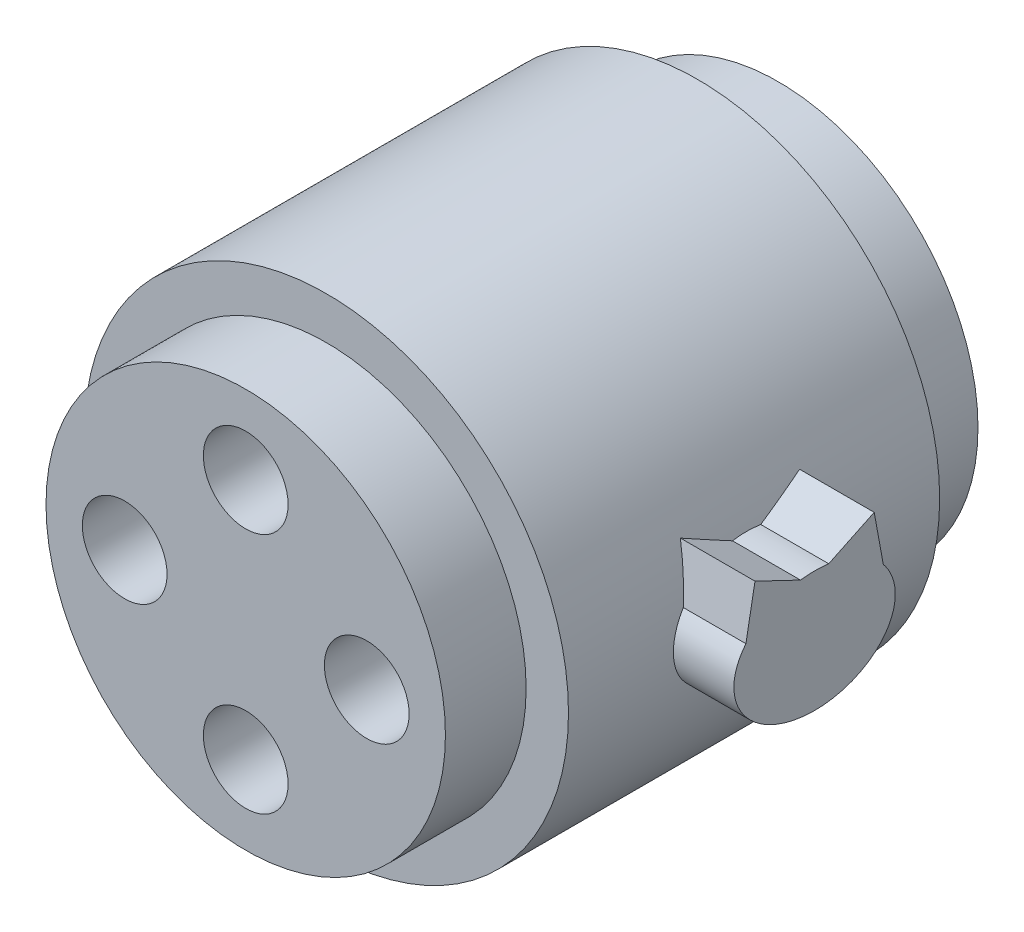
ISO-10303-21;
HEADER;
FILE_DESCRIPTION(('STEP AP214'),'2;1');
FILE_NAME('part.step','',(''),(''),'','','');
FILE_SCHEMA(('AUTOMOTIVE_DESIGN { 1 0 10303 214 1 1 1 1 }'));
ENDSEC;
DATA;
#1=APPLICATION_CONTEXT('core data for automotive mechanical design processes');
#2=APPLICATION_PROTOCOL_DEFINITION('international standard','automotive_design',2000,#1);
#3=PRODUCT_CONTEXT('',#1,'mechanical');
#4=PRODUCT('Part','Part','',(#3));
#5=PRODUCT_RELATED_PRODUCT_CATEGORY('part','',(#4));
#6=PRODUCT_DEFINITION_FORMATION('','',#4);
#7=PRODUCT_DEFINITION_CONTEXT('part definition',#1,'design');
#8=PRODUCT_DEFINITION('design','',#6,#7);
#9=PRODUCT_DEFINITION_SHAPE('','',#8);
#10=(LENGTH_UNIT() NAMED_UNIT(*) SI_UNIT(.MILLI.,.METRE.));
#11=(NAMED_UNIT(*) PLANE_ANGLE_UNIT() SI_UNIT($,.RADIAN.));
#12=(NAMED_UNIT(*) SI_UNIT($,.STERADIAN.) SOLID_ANGLE_UNIT());
#13=UNCERTAINTY_MEASURE_WITH_UNIT(LENGTH_MEASURE(1.E-05),#10,'distance_accuracy_value','');
#14=(GEOMETRIC_REPRESENTATION_CONTEXT(3) GLOBAL_UNCERTAINTY_ASSIGNED_CONTEXT((#13)) GLOBAL_UNIT_ASSIGNED_CONTEXT((#10,
#11,#12)) REPRESENTATION_CONTEXT('',''));
#15=CARTESIAN_POINT('',(0.,0.,0.));
#16=DIRECTION('',(0.,0.,1.));
#17=DIRECTION('',(1.,0.,0.));
#18=AXIS2_PLACEMENT_3D('',#15,#16,#17);
#19=CARTESIAN_POINT('',(0.,0.,18.4));
#20=DIRECTION('',(0.,0.,-1.));
#21=DIRECTION('',(-1.,0.,0.));
#22=AXIS2_PLACEMENT_3D('',#19,#20,#21);
#23=CYLINDRICAL_SURFACE('',#22,12.);
#24=CARTESIAN_POINT('',(0.,0.,0.));
#25=DIRECTION('',(0.,0.,1.));
#26=DIRECTION('',(1.,0.,0.));
#27=AXIS2_PLACEMENT_3D('',#24,#25,#26);
#28=CIRCLE('',#27,12.);
#29=CARTESIAN_POINT('',(12.,0.,0.));
#30=VERTEX_POINT('',#29);
#31=EDGE_CURVE('E133',#30,#30,#28,.T.);
#32=ORIENTED_EDGE('',*,*,#31,.T.);
#33=EDGE_LOOP('',(#32));
#34=FACE_BOUND('',#33,.T.);
#35=CARTESIAN_POINT('',(0.,0.,18.4));
#36=DIRECTION('',(0.,0.,1.));
#37=DIRECTION('',(1.,0.,0.));
#38=AXIS2_PLACEMENT_3D('',#35,#36,#37);
#39=CIRCLE('',#38,12.);
#40=CARTESIAN_POINT('',(12.,0.,18.4));
#41=VERTEX_POINT('',#40);
#42=EDGE_CURVE('E136',#41,#41,#39,.T.);
#43=ORIENTED_EDGE('',*,*,#42,.F.);
#44=EDGE_LOOP('',(#43));
#45=FACE_BOUND('',#44,.T.);
#46=CARTESIAN_POINT('',(11.8962728449935,1.57438635584461,12.6049134699478));
#47=CARTESIAN_POINT('',(11.9037063966343,1.51822172510228,12.6510882011753));
#48=CARTESIAN_POINT('',(11.9109609448049,1.46034322147685,12.6952491423253));
#49=CARTESIAN_POINT('',(11.9249557939834,1.34127652850436,12.7790771178229));
#50=CARTESIAN_POINT('',(11.9316955702307,1.28008506766983,12.8187395858631));
#51=CARTESIAN_POINT('',(11.9445287025237,1.1542350876311,12.8932396950093));
#52=CARTESIAN_POINT('',(11.9506177889056,1.08955741454649,12.9280458773047));
#53=CARTESIAN_POINT('',(11.9619302147823,0.957403252608567,12.9919957334759));
#54=CARTESIAN_POINT('',(11.9671538164957,0.88992761923722,13.0211411228834));
#55=CARTESIAN_POINT('',(11.9766082094655,0.752101682880088,13.0734445615846));
#56=CARTESIAN_POINT('',(11.9808321836287,0.681735277262009,13.0965616027868));
#57=CARTESIAN_POINT('',(11.9880976893493,0.539084424902589,13.1360879282335));
#58=CARTESIAN_POINT('',(11.9911393658446,0.466800214426163,13.1524980346934));
#59=CARTESIAN_POINT('',(11.99592123266,0.321187039881184,13.1782103438473));
#60=CARTESIAN_POINT('',(11.9976658506206,0.247862508925356,13.1875367299163));
#61=CARTESIAN_POINT('',(11.9998037352044,0.100639252737618,13.1989570381006));
#62=CARTESIAN_POINT('',(12.0001972154331,0.0267406201188081,13.2010521034377));
#63=CARTESIAN_POINT('',(11.9996562017581,-0.111180503750149,13.1981661063302));
#64=CARTESIAN_POINT('',(11.9988895660996,-0.175223569994169,13.1940795064391));
#65=CARTESIAN_POINT('',(11.9963510237841,-0.302718937154973,13.1804990992096));
#66=CARTESIAN_POINT('',(11.9945788088447,-0.36617105083609,13.1710036336616));
#67=CARTESIAN_POINT('',(11.9878165411145,-0.5550313391917,13.1345930410989));
#68=CARTESIAN_POINT('',(11.9813808670813,-0.678943129134058,13.0997537261989));
#69=CARTESIAN_POINT('',(11.9653666498953,-0.918956442463737,13.0113311423867));
#70=CARTESIAN_POINT('',(11.9558000998474,-1.03508576360309,12.9578193491066));
#71=CARTESIAN_POINT('',(11.934386040656,-1.25816654953333,12.834788831236));
#72=CARTESIAN_POINT('',(11.9225396482556,-1.36512247083268,12.7652779402854));
#73=CARTESIAN_POINT('',(11.9010661398476,-1.53947223035377,12.6349697232331));
#74=CARTESIAN_POINT('',(11.8917824336274,-1.6093887200084,12.5774282263823));
#75=CARTESIAN_POINT('',(11.8727997219063,-1.74391338003677,12.456540255933));
#76=CARTESIAN_POINT('',(11.8631007544323,-1.80852203489462,12.3931943132669));
#77=CARTESIAN_POINT('',(11.833616174105,-1.99538575106947,12.1945028956357));
#78=CARTESIAN_POINT('',(11.813599669199,-2.10947615909274,12.0514265018663));
#79=CARTESIAN_POINT('',(11.7748148117392,-2.31621049349719,11.750350617261));
#80=CARTESIAN_POINT('',(11.7560481710569,-2.40882541982624,11.5923313483474));
#81=CARTESIAN_POINT('',(11.7285240150054,-2.53851409983285,11.3346678906715));
#82=CARTESIAN_POINT('',(11.7188848855919,-2.58253222182486,11.2385326735728));
#83=CARTESIAN_POINT('',(11.7006951633041,-2.66373028983283,11.0434438364112));
#84=CARTESIAN_POINT('',(11.6921434316853,-2.7009174078693,10.9444932997826));
#85=CARTESIAN_POINT('',(11.6683717490659,-2.8025008730809,10.6441441900043));
#86=CARTESIAN_POINT('',(11.6550254009598,-2.85696412072775,10.4391574931619));
#87=CARTESIAN_POINT('',(11.6343306916965,-2.94009485776004,10.0238962070161));
#88=CARTESIAN_POINT('',(11.62698111434,-2.9687675778182,9.8136226988473));
#89=CARTESIAN_POINT('',(11.6187542408593,-3.00080424900437,9.39104391945148));
#90=CARTESIAN_POINT('',(11.6178764234539,-3.00417023851498,9.17873881324299));
#91=CARTESIAN_POINT('',(11.6226513112582,-2.9856436661135,8.75530098211659));
#92=CARTESIAN_POINT('',(11.6283041447381,-2.96375060808178,8.54416828030805));
#93=CARTESIAN_POINT('',(11.6457699970965,-2.8943611048877,8.12633485912796));
#94=CARTESIAN_POINT('',(11.6575837871579,-2.84686145445701,7.91963469796196));
#95=CARTESIAN_POINT('',(11.6865444212231,-2.72554181481355,7.514388807854));
#96=CARTESIAN_POINT('',(11.7036926799144,-2.65171484290061,7.31584525785511));
#97=CARTESIAN_POINT('',(11.7420121960555,-2.47653270294025,6.93128112749819));
#98=CARTESIAN_POINT('',(11.7631853835849,-2.37516431786924,6.7452666134019));
#99=CARTESIAN_POINT('',(11.7959112341958,-2.20444749837887,6.48463194347994));
#100=CARTESIAN_POINT('',(11.80670632603,-2.14606578800362,6.40261713209215));
#101=CARTESIAN_POINT('',(11.82846326266,-2.02271802790532,6.24373799427319));
#102=CARTESIAN_POINT('',(11.8394250235413,-1.95775520406018,6.16687117483984));
#103=CARTESIAN_POINT('',(11.8596739382067,-1.83075437144582,6.02956739530564));
#104=CARTESIAN_POINT('',(11.8689807490728,-1.76957947463158,5.96833661603703));
#105=CARTESIAN_POINT('',(11.8872585372417,-1.64232541890187,5.85103119089488));
#106=CARTESIAN_POINT('',(11.8962291322404,-1.57624091755845,5.79496231499905));
#107=CARTESIAN_POINT('',(11.9203885048505,-1.38544923562632,5.64710729620424));
#108=CARTESIAN_POINT('',(11.9349358134183,-1.25541655954856,5.56179980671185));
#109=CARTESIAN_POINT('',(11.954126921463,-1.05051663775025,5.45196459552233));
#110=CARTESIAN_POINT('',(11.9600893120557,-0.980515714204922,5.41835451652421));
#111=CARTESIAN_POINT('',(11.9709438627934,-0.837629274596836,5.35778250039789));
#112=CARTESIAN_POINT('',(11.9758367018083,-0.764745623170941,5.33081634482393));
#113=CARTESIAN_POINT('',(11.9841949049188,-0.619774198162619,5.28508418914881));
#114=CARTESIAN_POINT('',(11.9877120205183,-0.547783827531453,5.26601884845844));
#115=CARTESIAN_POINT('',(11.9934758999754,-0.402282447377263,5.23490957996076));
#116=CARTESIAN_POINT('',(11.9957233428113,-0.328772272439155,5.2228618992367));
#117=CARTESIAN_POINT('',(11.9988625832625,-0.180978886539131,5.20606219256591));
#118=CARTESIAN_POINT('',(11.9997559637769,-0.106696680567058,5.20130164789023));
#119=CARTESIAN_POINT('',(12.0001567570759,0.0419711690451212,5.19916385359988));
#120=CARTESIAN_POINT('',(11.9996643601342,0.116356797083163,5.20178559036302));
#121=CARTESIAN_POINT('',(11.9974892859724,0.253424610852865,5.21340840492597));
#122=CARTESIAN_POINT('',(11.99599511348,0.316197440634086,5.2213995707271));
#123=CARTESIAN_POINT('',(11.9920620194864,0.440846144914012,5.2425353518831));
#124=CARTESIAN_POINT('',(11.9896228135927,0.502721743585125,5.25568151856577));
#125=CARTESIAN_POINT('',(11.9809708079087,0.686547596673617,5.30260635453228));
#126=CARTESIAN_POINT('',(11.9734254101012,0.806593946868323,5.34386218818548));
#127=CARTESIAN_POINT('',(11.9553751932975,1.04070326214959,5.44474306936627));
#128=CARTESIAN_POINT('',(11.9448237286009,1.15463529729672,5.50465915806327));
#129=CARTESIAN_POINT('',(11.9275325649086,1.31793679931847,5.60577359835413));
#130=CARTESIAN_POINT('',(11.9215372547393,1.37101354564846,5.64127597955387));
#131=CARTESIAN_POINT('',(11.9091652907513,1.47461752632772,5.71569641271037));
#132=CARTESIAN_POINT('',(11.9027888972131,1.52514645831765,5.75461214165111));
#133=CARTESIAN_POINT('',(11.8962728449936,1.57438635584461,5.79508653005224));
#134=B_SPLINE_CURVE_WITH_KNOTS('',3,(#46,#47,#48,#49,#50,#51,#52,#53,#54,#55,#56,#57,#58,#59,
#60,#61,#62,#63,#64,#65,#66,#67,#68,#69,#70,#71,#72,#73,#74,#75,#76,#77,#78,#79,#80,#81,#82,#83,
#84,#85,#86,#87,#88,#89,#90,#91,#92,#93,#94,#95,#96,#97,#98,#99,#100,#101,#102,#103,#104,#105,
#106,#107,#108,#109,#110,#111,#112,#113,#114,#115,#116,#117,#118,#119,#120,#121,#122,#123,#124,
#125,#126,#127,#128,#129,#130,#131,#132,#133),.UNSPECIFIED.,.F.,.F.,(4,2,2,2,2,2,2,2,2,2,2,2,2,
2,2,2,2,2,2,2,2,2,2,2,2,2,2,2,2,2,2,2,2,2,2,2,2,2,2,2,2,2,2,4),(0.,0.219255356885017,
0.4387313202788,0.659568870897647,0.880339390801339,1.10257468901689,1.32478273482174,
1.5462287236593,1.76763970181449,1.9599290236393,2.15227732784365,2.53697491961896,
2.9202158106778,3.30326945313727,3.57600579161293,3.8487172077655,4.39865419087127,
4.94932952820332,5.26760113515917,5.58553664763478,6.22110552465607,6.85654547050865,
7.49193423299678,8.12733547553559,8.76281627198374,9.39846574021187,10.0344207947507,
10.3378919831502,10.6412151316635,10.9020866590773,11.1632463354464,11.6292448208204,
11.8626126248264,12.0958318718539,12.3191573897892,12.5423633673956,12.7653082153559,
12.9882224534256,13.1778855823182,13.3676058316214,13.7473526164502,14.1333469397831,
14.3256356523332,14.5177944999135),.UNSPECIFIED.);
#135=CARTESIAN_POINT('',(11.8962728449935,1.57438635584461,12.6049134699478));
#136=VERTEX_POINT('',#135);
#137=CARTESIAN_POINT('',(11.8962728449935,1.57438635584461,5.79508653005224));
#138=VERTEX_POINT('',#137);
#139=EDGE_CURVE('E11',#136,#138,#134,.T.);
#140=ORIENTED_EDGE('',*,*,#139,.F.);
#141=CARTESIAN_POINT('',(0.,0.,12.8931037607253));
#142=DIRECTION('',(0.,-0.180057538320753,-0.983656079579581));
#143=DIRECTION('',(0.,0.983656079579581,-0.180057538320753));
#144=AXIS2_PLACEMENT_3D('',#141,#142,#143);
#145=ELLIPSE('',#144,12.1993857905386,12.);
#146=CARTESIAN_POINT('',(11.3017991280935,4.03352655479356,12.1547696241459));
#147=VERTEX_POINT('',#146);
#148=EDGE_CURVE('E129',#147,#136,#145,.T.);
#149=ORIENTED_EDGE('',*,*,#148,.F.);
#150=CARTESIAN_POINT('',(0.,0.,3.73238201635148));
#151=DIRECTION('',(0.,-0.90190784965835,0.431928501866513));
#152=DIRECTION('',(0.,-0.431928501866513,-0.90190784965835));
#153=AXIS2_PLACEMENT_3D('',#150,#151,#152);
#154=ELLIPSE('',#153,27.7823758981957,12.);
#155=CARTESIAN_POINT('',(11.6308050022344,2.95370530012728,9.9));
#156=VERTEX_POINT('',#155);
#157=EDGE_CURVE('E143',#156,#147,#154,.T.);
#158=ORIENTED_EDGE('',*,*,#157,.F.);
#159=CARTESIAN_POINT('',(11.6308050022344,2.95370530012728,8.5));
#160=CARTESIAN_POINT('',(11.6288340773063,2.96146398499187,8.55820487234388));
#161=CARTESIAN_POINT('',(11.6271046295052,2.96824364206023,8.61654795837389));
#162=CARTESIAN_POINT('',(11.6241407164008,2.97983082530846,8.73323712219209));
#163=CARTESIAN_POINT('',(11.6229045500876,2.98464513006814,8.79158248350618));
#164=CARTESIAN_POINT('',(11.6209277117707,2.99233251784802,8.90827377573923));
#165=CARTESIAN_POINT('',(11.620185901832,2.99521005916355,8.96661939403912));
#166=CARTESIAN_POINT('',(11.6191973522215,2.99904268595093,9.08331006023732));
#167=CARTESIAN_POINT('',(11.6189500386482,2.99999999999999,9.14165503011846));
#168=CARTESIAN_POINT('',(11.6189500386482,3.,9.25834496988074));
#169=CARTESIAN_POINT('',(11.6191973522215,2.99904268595095,9.31668993976188));
#170=CARTESIAN_POINT('',(11.620185901832,2.99521005916359,9.43338060596008));
#171=CARTESIAN_POINT('',(11.6209277117706,2.99233251784806,9.49172622425997));
#172=CARTESIAN_POINT('',(11.6229045500876,2.9846451300682,9.60841751649302));
#173=CARTESIAN_POINT('',(11.6241407164008,2.97983082530854,9.66676287780712));
#174=CARTESIAN_POINT('',(11.6271046295051,2.96824364206031,9.78345204162532));
#175=CARTESIAN_POINT('',(11.628834077306,2.96146398499192,9.84179512765533));
#176=CARTESIAN_POINT('',(11.6308050022334,2.95370530012726,9.89999999999922));
#177=B_SPLINE_CURVE_WITH_KNOTS('',3,(#159,#160,#161,#162,#163,#164,#165,#166,#167,#168,#169,
#170,#171,#172,#173,#174,#175,#176),.UNSPECIFIED.,.F.,.F.,(4,2,2,2,2,2,2,2,4),(0.,
0.176248835276106,0.351884538060842,0.527114544088652,0.702141063746791,0.877167583404928,
1.05239758943274,1.22803329221748,1.40428212749358),.UNSPECIFIED.);
#178=CARTESIAN_POINT('',(11.6308050022344,2.95370530012728,8.5));
#179=VERTEX_POINT('',#178);
#180=EDGE_CURVE('E146',#179,#156,#177,.T.);
#181=ORIENTED_EDGE('',*,*,#180,.F.);
#182=CARTESIAN_POINT('',(0.,0.,14.6676179836485));
#183=DIRECTION('',(0.,-0.90190784965835,-0.431928501866513));
#184=DIRECTION('',(0.,0.431928501866513,-0.90190784965835));
#185=AXIS2_PLACEMENT_3D('',#182,#183,#184);
#186=ELLIPSE('',#185,27.7823758981957,12.);
#187=CARTESIAN_POINT('',(11.3017991280935,4.03352655479356,6.24523037585412));
#188=VERTEX_POINT('',#187);
#189=EDGE_CURVE('E64',#188,#179,#186,.T.);
#190=ORIENTED_EDGE('',*,*,#189,.F.);
#191=CARTESIAN_POINT('',(0.,0.,5.50689623927467));
#192=DIRECTION('',(0.,-0.180057538320753,0.983656079579581));
#193=DIRECTION('',(0.,-0.983656079579581,-0.180057538320753));
#194=AXIS2_PLACEMENT_3D('',#191,#192,#193);
#195=ELLIPSE('',#194,12.1993857905386,12.);
#196=EDGE_CURVE('E54',#138,#188,#195,.T.);
#197=ORIENTED_EDGE('',*,*,#196,.F.);
#198=EDGE_LOOP('',(#140,#149,#158,#181,#190,#197));
#199=FACE_BOUND('',#198,.T.);
#200=ADVANCED_FACE('F41',(#34,#45,#199),#23,.T.);
#201=CARTESIAN_POINT('',(0.,0.,18.4));
#202=DIRECTION('',(0.,0.,1.));
#203=DIRECTION('',(1.,0.,0.));
#204=AXIS2_PLACEMENT_3D('',#201,#202,#203);
#205=PLANE('',#204);
#206=CARTESIAN_POINT('',(0.,0.,18.4));
#207=DIRECTION('',(0.,0.,1.));
#208=DIRECTION('',(1.,0.,0.));
#209=AXIS2_PLACEMENT_3D('',#206,#207,#208);
#210=CIRCLE('',#209,9.9);
#211=CARTESIAN_POINT('',(9.9,0.,18.4));
#212=VERTEX_POINT('',#211);
#213=EDGE_CURVE('E130',#212,#212,#210,.T.);
#214=ORIENTED_EDGE('',*,*,#213,.F.);
#215=EDGE_LOOP('',(#214));
#216=FACE_BOUND('',#215,.T.);
#217=ORIENTED_EDGE('',*,*,#42,.T.);
#218=EDGE_LOOP('',(#217));
#219=FACE_BOUND('',#218,.T.);
#220=ADVANCED_FACE('F190',(#216,#219),#205,.T.);
#221=CARTESIAN_POINT('',(0.,0.,0.));
#222=DIRECTION('',(0.,0.,1.));
#223=DIRECTION('',(1.,0.,0.));
#224=AXIS2_PLACEMENT_3D('',#221,#222,#223);
#225=PLANE('',#224);
#226=CARTESIAN_POINT('',(0.,0.,0.));
#227=DIRECTION('',(0.,0.,-1.));
#228=DIRECTION('',(-1.,0.,0.));
#229=AXIS2_PLACEMENT_3D('',#226,#227,#228);
#230=CIRCLE('',#229,9.9);
#231=CARTESIAN_POINT('',(-9.9,0.,0.));
#232=VERTEX_POINT('',#231);
#233=EDGE_CURVE('E126',#232,#232,#230,.T.);
#234=ORIENTED_EDGE('',*,*,#233,.F.);
#235=EDGE_LOOP('',(#234));
#236=FACE_BOUND('',#235,.T.);
#237=ORIENTED_EDGE('',*,*,#31,.F.);
#238=EDGE_LOOP('',(#237));
#239=FACE_BOUND('',#238,.T.);
#240=ADVANCED_FACE('F197',(#236,#239),#225,.F.);
#241=CARTESIAN_POINT('',(0.,0.,22.4));
#242=DIRECTION('',(0.,0.,-1.));
#243=DIRECTION('',(-1.,0.,0.));
#244=AXIS2_PLACEMENT_3D('',#241,#242,#243);
#245=CYLINDRICAL_SURFACE('',#244,9.9);
#246=CARTESIAN_POINT('',(0.,0.,22.4));
#247=DIRECTION('',(0.,0.,1.));
#248=DIRECTION('',(1.,0.,0.));
#249=AXIS2_PLACEMENT_3D('',#246,#247,#248);
#250=CIRCLE('',#249,9.9);
#251=CARTESIAN_POINT('',(9.9,0.,22.4));
#252=VERTEX_POINT('',#251);
#253=EDGE_CURVE('E120',#252,#252,#250,.T.);
#254=ORIENTED_EDGE('',*,*,#253,.F.);
#255=EDGE_LOOP('',(#254));
#256=FACE_BOUND('',#255,.T.);
#257=ORIENTED_EDGE('',*,*,#213,.T.);
#258=EDGE_LOOP('',(#257));
#259=FACE_BOUND('',#258,.T.);
#260=ADVANCED_FACE('F206',(#256,#259),#245,.T.);
#261=CARTESIAN_POINT('',(0.,0.,22.4));
#262=DIRECTION('',(0.,0.,1.));
#263=DIRECTION('',(1.,0.,0.));
#264=AXIS2_PLACEMENT_3D('',#261,#262,#263);
#265=PLANE('',#264);
#266=CARTESIAN_POINT('',(0.,6.,22.4));
#267=DIRECTION('',(0.,0.,1.));
#268=DIRECTION('',(1.,0.,0.));
#269=AXIS2_PLACEMENT_3D('',#266,#267,#268);
#270=CIRCLE('',#269,2.1);
#271=CARTESIAN_POINT('',(2.1,6.,22.4));
#272=VERTEX_POINT('',#271);
#273=EDGE_CURVE('E246',#272,#272,#270,.T.);
#274=ORIENTED_EDGE('',*,*,#273,.F.);
#275=EDGE_LOOP('',(#274));
#276=FACE_BOUND('',#275,.T.);
#277=CARTESIAN_POINT('',(6.,0.,22.4));
#278=DIRECTION('',(0.,0.,1.));
#279=DIRECTION('',(1.,0.,0.));
#280=AXIS2_PLACEMENT_3D('',#277,#278,#279);
#281=CIRCLE('',#280,2.1);
#282=CARTESIAN_POINT('',(8.1,0.,22.4));
#283=VERTEX_POINT('',#282);
#284=EDGE_CURVE('E243',#283,#283,#281,.T.);
#285=ORIENTED_EDGE('',*,*,#284,.F.);
#286=EDGE_LOOP('',(#285));
#287=FACE_BOUND('',#286,.T.);
#288=CARTESIAN_POINT('',(0.,-6.,22.4));
#289=DIRECTION('',(0.,0.,1.));
#290=DIRECTION('',(1.,0.,0.));
#291=AXIS2_PLACEMENT_3D('',#288,#289,#290);
#292=CIRCLE('',#291,2.1);
#293=CARTESIAN_POINT('',(2.1,-6.,22.4));
#294=VERTEX_POINT('',#293);
#295=EDGE_CURVE('E237',#294,#294,#292,.T.);
#296=ORIENTED_EDGE('',*,*,#295,.F.);
#297=EDGE_LOOP('',(#296));
#298=FACE_BOUND('',#297,.T.);
#299=CARTESIAN_POINT('',(-6.,0.,22.4));
#300=DIRECTION('',(0.,0.,1.));
#301=DIRECTION('',(1.,0.,0.));
#302=AXIS2_PLACEMENT_3D('',#299,#300,#301);
#303=CIRCLE('',#302,2.1);
#304=CARTESIAN_POINT('',(-3.9,0.,22.4));
#305=VERTEX_POINT('',#304);
#306=EDGE_CURVE('E231',#305,#305,#303,.T.);
#307=ORIENTED_EDGE('',*,*,#306,.F.);
#308=EDGE_LOOP('',(#307));
#309=FACE_BOUND('',#308,.T.);
#310=ORIENTED_EDGE('',*,*,#253,.T.);
#311=EDGE_LOOP('',(#310));
#312=FACE_BOUND('',#311,.T.);
#313=ADVANCED_FACE('F211',(#276,#287,#298,#309,#312),#265,.T.);
#314=CARTESIAN_POINT('',(0.,0.,-4.));
#315=DIRECTION('',(0.,0.,1.));
#316=DIRECTION('',(1.,0.,0.));
#317=AXIS2_PLACEMENT_3D('',#314,#315,#316);
#318=CYLINDRICAL_SURFACE('',#317,9.9);
#319=CARTESIAN_POINT('',(0.,0.,-4.));
#320=DIRECTION('',(0.,0.,-1.));
#321=DIRECTION('',(-1.,0.,0.));
#322=AXIS2_PLACEMENT_3D('',#319,#320,#321);
#323=CIRCLE('',#322,9.9);
#324=CARTESIAN_POINT('',(-9.9,0.,-4.));
#325=VERTEX_POINT('',#324);
#326=EDGE_CURVE('E117',#325,#325,#323,.T.);
#327=ORIENTED_EDGE('',*,*,#326,.F.);
#328=EDGE_LOOP('',(#327));
#329=FACE_BOUND('',#328,.T.);
#330=ORIENTED_EDGE('',*,*,#233,.T.);
#331=EDGE_LOOP('',(#330));
#332=FACE_BOUND('',#331,.T.);
#333=ADVANCED_FACE('F218',(#329,#332),#318,.T.);
#334=CARTESIAN_POINT('',(0.,0.,-4.));
#335=DIRECTION('',(0.,0.,-1.));
#336=DIRECTION('',(-1.,0.,0.));
#337=AXIS2_PLACEMENT_3D('',#334,#335,#336);
#338=PLANE('',#337);
#339=CARTESIAN_POINT('',(0.,6.,-4.));
#340=DIRECTION('',(0.,0.,1.));
#341=DIRECTION('',(1.,0.,0.));
#342=AXIS2_PLACEMENT_3D('',#339,#340,#341);
#343=CIRCLE('',#342,2.1);
#344=CARTESIAN_POINT('',(2.1,6.,-4.));
#345=VERTEX_POINT('',#344);
#346=EDGE_CURVE('E114',#345,#345,#343,.T.);
#347=ORIENTED_EDGE('',*,*,#346,.T.);
#348=EDGE_LOOP('',(#347));
#349=FACE_BOUND('',#348,.T.);
#350=CARTESIAN_POINT('',(6.,0.,-4.));
#351=DIRECTION('',(0.,0.,1.));
#352=DIRECTION('',(1.,0.,0.));
#353=AXIS2_PLACEMENT_3D('',#350,#351,#352);
#354=CIRCLE('',#353,2.1);
#355=CARTESIAN_POINT('',(8.1,0.,-4.));
#356=VERTEX_POINT('',#355);
#357=EDGE_CURVE('E240',#356,#356,#354,.T.);
#358=ORIENTED_EDGE('',*,*,#357,.T.);
#359=EDGE_LOOP('',(#358));
#360=FACE_BOUND('',#359,.T.);
#361=CARTESIAN_POINT('',(0.,-6.,-4.));
#362=DIRECTION('',(0.,0.,1.));
#363=DIRECTION('',(1.,0.,0.));
#364=AXIS2_PLACEMENT_3D('',#361,#362,#363);
#365=CIRCLE('',#364,2.1);
#366=CARTESIAN_POINT('',(2.1,-6.,-4.));
#367=VERTEX_POINT('',#366);
#368=EDGE_CURVE('E234',#367,#367,#365,.T.);
#369=ORIENTED_EDGE('',*,*,#368,.T.);
#370=EDGE_LOOP('',(#369));
#371=FACE_BOUND('',#370,.T.);
#372=CARTESIAN_POINT('',(-6.,0.,-4.));
#373=DIRECTION('',(0.,0.,1.));
#374=DIRECTION('',(1.,0.,0.));
#375=AXIS2_PLACEMENT_3D('',#372,#373,#374);
#376=CIRCLE('',#375,2.1);
#377=CARTESIAN_POINT('',(-3.9,0.,-4.));
#378=VERTEX_POINT('',#377);
#379=EDGE_CURVE('E228',#378,#378,#376,.T.);
#380=ORIENTED_EDGE('',*,*,#379,.T.);
#381=EDGE_LOOP('',(#380));
#382=FACE_BOUND('',#381,.T.);
#383=ORIENTED_EDGE('',*,*,#326,.T.);
#384=EDGE_LOOP('',(#383));
#385=FACE_BOUND('',#384,.T.);
#386=ADVANCED_FACE('F221',(#349,#360,#371,#382,#385),#338,.T.);
#387=CARTESIAN_POINT('',(15.,0.,9.2));
#388=DIRECTION('',(1.,0.,0.));
#389=DIRECTION('',(0.,0.,-1.));
#390=AXIS2_PLACEMENT_3D('',#387,#388,#389);
#391=ELLIPSE('',#390,4.,3.);
#392=DIRECTION('',(-1.,0.,0.));
#393=VECTOR('',#392,1.);
#394=SURFACE_OF_LINEAR_EXTRUSION('',#391,#393);
#395=DIRECTION('',(-1.,0.,0.));
#396=VECTOR('',#395,1.);
#397=CARTESIAN_POINT('',(15.,1.57438635584461,12.6049134699478));
#398=LINE('',#397,#396);
#399=CARTESIAN_POINT('',(15.,1.57438635584461,12.6049134699478));
#400=VERTEX_POINT('',#399);
#401=EDGE_CURVE('E172',#400,#136,#398,.T.);
#402=ORIENTED_EDGE('',*,*,#401,.T.);
#403=ORIENTED_EDGE('',*,*,#139,.T.);
#404=DIRECTION('',(-1.,0.,0.));
#405=VECTOR('',#404,1.);
#406=CARTESIAN_POINT('',(15.,1.57438635584461,5.79508653005224));
#407=LINE('',#406,#405);
#408=CARTESIAN_POINT('',(15.,1.57438635584461,5.79508653005224));
#409=VERTEX_POINT('',#408);
#410=EDGE_CURVE('E99',#409,#138,#407,.T.);
#411=ORIENTED_EDGE('',*,*,#410,.F.);
#412=EDGE_CURVE('E105',#400,#409,#391,.T.);
#413=ORIENTED_EDGE('',*,*,#412,.F.);
#414=EDGE_LOOP('',(#402,#403,#411,#413));
#415=FACE_BOUND('',#414,.T.);
#416=ADVANCED_FACE('F116',(#415),#394,.F.);
#417=CARTESIAN_POINT('',(15.,0.,9.2));
#418=DIRECTION('',(1.,0.,0.));
#419=DIRECTION('',(0.,0.,-1.));
#420=AXIS2_PLACEMENT_3D('',#417,#418,#419);
#421=ELLIPSE('',#420,4.,3.);
#422=DIRECTION('',(-1.,0.,0.));
#423=VECTOR('',#422,1.);
#424=SURFACE_OF_LINEAR_EXTRUSION('',#421,#423);
#425=DIRECTION('',(-1.,0.,0.));
#426=VECTOR('',#425,1.);
#427=CARTESIAN_POINT('',(15.,2.95370530012728,8.5));
#428=LINE('',#427,#426);
#429=CARTESIAN_POINT('',(15.,2.95370530012728,8.5));
#430=VERTEX_POINT('',#429);
#431=EDGE_CURVE('E122',#430,#179,#428,.T.);
#432=ORIENTED_EDGE('',*,*,#431,.T.);
#433=ORIENTED_EDGE('',*,*,#180,.T.);
#434=DIRECTION('',(-1.,0.,0.));
#435=VECTOR('',#434,1.);
#436=CARTESIAN_POINT('',(15.,2.95370530012728,9.9));
#437=LINE('',#436,#435);
#438=CARTESIAN_POINT('',(15.,2.95370530012728,9.9));
#439=VERTEX_POINT('',#438);
#440=EDGE_CURVE('E177',#439,#156,#437,.T.);
#441=ORIENTED_EDGE('',*,*,#440,.F.);
#442=EDGE_CURVE('E165',#430,#439,#421,.T.);
#443=ORIENTED_EDGE('',*,*,#442,.F.);
#444=EDGE_LOOP('',(#432,#433,#441,#443));
#445=FACE_BOUND('',#444,.T.);
#446=ADVANCED_FACE('F154',(#445),#424,.F.);
#447=CARTESIAN_POINT('',(15.,4.03352655479356,6.24523037585412));
#448=DIRECTION('',(0.,-0.180057538320753,0.983656079579581));
#449=DIRECTION('',(0.,-0.983656079579581,-0.180057538320753));
#450=AXIS2_PLACEMENT_3D('',#447,#448,#449);
#451=PLANE('',#450);
#452=ORIENTED_EDGE('',*,*,#410,.T.);
#453=ORIENTED_EDGE('',*,*,#196,.T.);
#454=DIRECTION('',(-1.,0.,0.));
#455=VECTOR('',#454,1.);
#456=CARTESIAN_POINT('',(15.,4.03352655479356,6.24523037585412));
#457=LINE('',#456,#455);
#458=CARTESIAN_POINT('',(15.,4.03352655479356,6.24523037585412));
#459=VERTEX_POINT('',#458);
#460=EDGE_CURVE('E101',#459,#188,#457,.T.);
#461=ORIENTED_EDGE('',*,*,#460,.F.);
#462=DIRECTION('',(0.,0.983656079579581,0.180057538320753));
#463=VECTOR('',#462,1.);
#464=CARTESIAN_POINT('',(15.,4.03352655479356,6.24523037585412));
#465=LINE('',#464,#463);
#466=EDGE_CURVE('E95',#409,#459,#465,.T.);
#467=ORIENTED_EDGE('',*,*,#466,.F.);
#468=EDGE_LOOP('',(#452,#453,#461,#467));
#469=FACE_BOUND('',#468,.T.);
#470=ADVANCED_FACE('F97',(#469),#451,.F.);
#471=CARTESIAN_POINT('',(15.,4.03352655479356,6.24523037585412));
#472=DIRECTION('',(0.,-0.90190784965835,-0.431928501866513));
#473=DIRECTION('',(0.,0.431928501866513,-0.90190784965835));
#474=AXIS2_PLACEMENT_3D('',#471,#472,#473);
#475=PLANE('',#474);
#476=ORIENTED_EDGE('',*,*,#460,.T.);
#477=ORIENTED_EDGE('',*,*,#189,.T.);
#478=ORIENTED_EDGE('',*,*,#431,.F.);
#479=DIRECTION('',(0.,-0.431928501866513,0.90190784965835));
#480=VECTOR('',#479,1.);
#481=CARTESIAN_POINT('',(15.,4.03352655479356,6.24523037585412));
#482=LINE('',#481,#480);
#483=EDGE_CURVE('E104',#459,#430,#482,.T.);
#484=ORIENTED_EDGE('',*,*,#483,.F.);
#485=EDGE_LOOP('',(#476,#477,#478,#484));
#486=FACE_BOUND('',#485,.T.);
#487=ADVANCED_FACE('F163',(#486),#475,.F.);
#488=CARTESIAN_POINT('',(15.,4.03352655479356,12.1547696241459));
#489=DIRECTION('',(0.,-0.90190784965835,0.431928501866513));
#490=DIRECTION('',(0.,-0.431928501866513,-0.90190784965835));
#491=AXIS2_PLACEMENT_3D('',#488,#489,#490);
#492=PLANE('',#491);
#493=ORIENTED_EDGE('',*,*,#440,.T.);
#494=ORIENTED_EDGE('',*,*,#157,.T.);
#495=DIRECTION('',(-1.,0.,0.));
#496=VECTOR('',#495,1.);
#497=CARTESIAN_POINT('',(15.,4.03352655479356,12.1547696241459));
#498=LINE('',#497,#496);
#499=CARTESIAN_POINT('',(15.,4.03352655479356,12.1547696241459));
#500=VERTEX_POINT('',#499);
#501=EDGE_CURVE('E174',#500,#147,#498,.T.);
#502=ORIENTED_EDGE('',*,*,#501,.F.);
#503=DIRECTION('',(0.,0.431928501866513,0.90190784965835));
#504=VECTOR('',#503,1.);
#505=CARTESIAN_POINT('',(15.,4.03352655479356,12.1547696241459));
#506=LINE('',#505,#504);
#507=EDGE_CURVE('E169',#439,#500,#506,.T.);
#508=ORIENTED_EDGE('',*,*,#507,.F.);
#509=EDGE_LOOP('',(#493,#494,#502,#508));
#510=FACE_BOUND('',#509,.T.);
#511=ADVANCED_FACE('F161',(#510),#492,.F.);
#512=CARTESIAN_POINT('',(15.,4.03352655479356,12.1547696241459));
#513=DIRECTION('',(0.,-0.180057538320753,-0.983656079579581));
#514=DIRECTION('',(0.,0.983656079579581,-0.180057538320753));
#515=AXIS2_PLACEMENT_3D('',#512,#513,#514);
#516=PLANE('',#515);
#517=ORIENTED_EDGE('',*,*,#501,.T.);
#518=ORIENTED_EDGE('',*,*,#148,.T.);
#519=ORIENTED_EDGE('',*,*,#401,.F.);
#520=DIRECTION('',(0.,-0.983656079579581,0.180057538320753));
#521=VECTOR('',#520,1.);
#522=CARTESIAN_POINT('',(15.,4.03352655479356,12.1547696241459));
#523=LINE('',#522,#521);
#524=EDGE_CURVE('E110',#500,#400,#523,.T.);
#525=ORIENTED_EDGE('',*,*,#524,.F.);
#526=EDGE_LOOP('',(#517,#518,#519,#525));
#527=FACE_BOUND('',#526,.T.);
#528=ADVANCED_FACE('F188',(#527),#516,.F.);
#529=CARTESIAN_POINT('',(15.,0.,9.2));
#530=DIRECTION('',(1.,0.,0.));
#531=DIRECTION('',(0.,0.,-1.));
#532=AXIS2_PLACEMENT_3D('',#529,#530,#531);
#533=PLANE('',#532);
#534=ORIENTED_EDGE('',*,*,#412,.T.);
#535=ORIENTED_EDGE('',*,*,#466,.T.);
#536=ORIENTED_EDGE('',*,*,#483,.T.);
#537=ORIENTED_EDGE('',*,*,#442,.T.);
#538=ORIENTED_EDGE('',*,*,#507,.T.);
#539=ORIENTED_EDGE('',*,*,#524,.T.);
#540=EDGE_LOOP('',(#534,#535,#536,#537,#538,#539));
#541=FACE_BOUND('',#540,.T.);
#542=ADVANCED_FACE('F108',(#541),#533,.T.);
#543=CARTESIAN_POINT('',(-6.,0.,-4.));
#544=DIRECTION('',(0.,0.,1.));
#545=DIRECTION('',(1.,0.,0.));
#546=AXIS2_PLACEMENT_3D('',#543,#544,#545);
#547=CYLINDRICAL_SURFACE('',#546,2.1);
#548=ORIENTED_EDGE('',*,*,#379,.F.);
#549=EDGE_LOOP('',(#548));
#550=FACE_BOUND('',#549,.T.);
#551=ORIENTED_EDGE('',*,*,#306,.T.);
#552=EDGE_LOOP('',(#551));
#553=FACE_BOUND('',#552,.T.);
#554=ADVANCED_FACE('F270',(#550,#553),#547,.F.);
#555=CARTESIAN_POINT('',(0.,-6.,-4.));
#556=DIRECTION('',(0.,0.,1.));
#557=DIRECTION('',(1.,0.,0.));
#558=AXIS2_PLACEMENT_3D('',#555,#556,#557);
#559=CYLINDRICAL_SURFACE('',#558,2.1);
#560=ORIENTED_EDGE('',*,*,#368,.F.);
#561=EDGE_LOOP('',(#560));
#562=FACE_BOUND('',#561,.T.);
#563=ORIENTED_EDGE('',*,*,#295,.T.);
#564=EDGE_LOOP('',(#563));
#565=FACE_BOUND('',#564,.T.);
#566=ADVANCED_FACE('F272',(#562,#565),#559,.F.);
#567=CARTESIAN_POINT('',(6.,0.,-4.));
#568=DIRECTION('',(0.,0.,1.));
#569=DIRECTION('',(1.,0.,0.));
#570=AXIS2_PLACEMENT_3D('',#567,#568,#569);
#571=CYLINDRICAL_SURFACE('',#570,2.1);
#572=ORIENTED_EDGE('',*,*,#357,.F.);
#573=EDGE_LOOP('',(#572));
#574=FACE_BOUND('',#573,.T.);
#575=ORIENTED_EDGE('',*,*,#284,.T.);
#576=EDGE_LOOP('',(#575));
#577=FACE_BOUND('',#576,.T.);
#578=ADVANCED_FACE('F256',(#574,#577),#571,.F.);
#579=CARTESIAN_POINT('',(0.,6.,-4.));
#580=DIRECTION('',(0.,0.,1.));
#581=DIRECTION('',(1.,0.,0.));
#582=AXIS2_PLACEMENT_3D('',#579,#580,#581);
#583=CYLINDRICAL_SURFACE('',#582,2.1);
#584=ORIENTED_EDGE('',*,*,#346,.F.);
#585=EDGE_LOOP('',(#584));
#586=FACE_BOUND('',#585,.T.);
#587=ORIENTED_EDGE('',*,*,#273,.T.);
#588=EDGE_LOOP('',(#587));
#589=FACE_BOUND('',#588,.T.);
#590=ADVANCED_FACE('F253',(#586,#589),#583,.F.);
#591=CLOSED_SHELL('',(#200,#220,#240,#260,#313,#333,#386,#416,#446,#470,#487,#511,#528,#542,
#554,#566,#578,#590));
#592=MANIFOLD_SOLID_BREP('B2',#591);
#593=ADVANCED_BREP_SHAPE_REPRESENTATION('',(#18,#592),#14);
#594=SHAPE_DEFINITION_REPRESENTATION(#9,#593);
ENDSEC;
END-ISO-10303-21;
